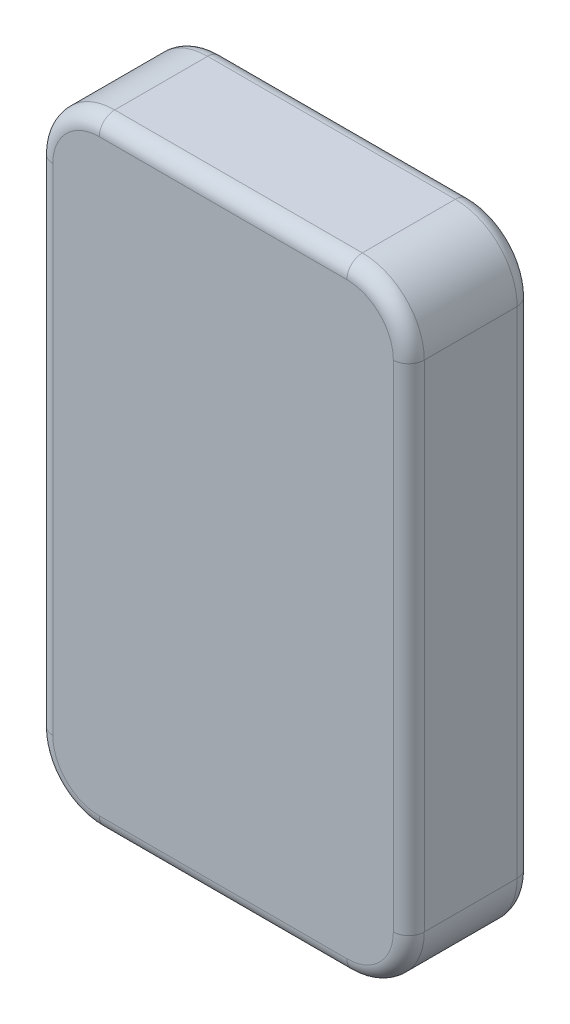
ISO-10303-21;
HEADER;
FILE_DESCRIPTION(('STEP AP214'),'2;1');
FILE_NAME('part.step','',(''),(''),'','','');
FILE_SCHEMA(('AUTOMOTIVE_DESIGN { 1 0 10303 214 1 1 1 1 }'));
ENDSEC;
DATA;
#1=APPLICATION_CONTEXT('core data for automotive mechanical design processes');
#2=APPLICATION_PROTOCOL_DEFINITION('international standard','automotive_design',2000,#1);
#3=PRODUCT_CONTEXT('',#1,'mechanical');
#4=PRODUCT('Part','Part','',(#3));
#5=PRODUCT_RELATED_PRODUCT_CATEGORY('part','',(#4));
#6=PRODUCT_DEFINITION_FORMATION('','',#4);
#7=PRODUCT_DEFINITION_CONTEXT('part definition',#1,'design');
#8=PRODUCT_DEFINITION('design','',#6,#7);
#9=PRODUCT_DEFINITION_SHAPE('','',#8);
#10=(LENGTH_UNIT() NAMED_UNIT(*) SI_UNIT(.MILLI.,.METRE.));
#11=(NAMED_UNIT(*) PLANE_ANGLE_UNIT() SI_UNIT($,.RADIAN.));
#12=(NAMED_UNIT(*) SI_UNIT($,.STERADIAN.) SOLID_ANGLE_UNIT());
#13=UNCERTAINTY_MEASURE_WITH_UNIT(LENGTH_MEASURE(1.E-05),#10,'distance_accuracy_value','');
#14=(GEOMETRIC_REPRESENTATION_CONTEXT(3) GLOBAL_UNCERTAINTY_ASSIGNED_CONTEXT((#13)) GLOBAL_UNIT_ASSIGNED_CONTEXT((#10,
#11,#12)) REPRESENTATION_CONTEXT('',''));
#15=CARTESIAN_POINT('',(0.,0.,0.));
#16=DIRECTION('',(0.,0.,1.));
#17=DIRECTION('',(1.,0.,0.));
#18=AXIS2_PLACEMENT_3D('',#15,#16,#17);
#19=CARTESIAN_POINT('',(-47.4485607369744,362.247885871218,-8.));
#20=DIRECTION('',(-1.,0.,0.));
#21=DIRECTION('',(0.,-1.,0.));
#22=AXIS2_PLACEMENT_3D('',#19,#20,#21);
#23=PLANE('',#22);
#24=DIRECTION('',(0.,0.,1.));
#25=VECTOR('',#24,1.);
#26=CARTESIAN_POINT('',(-47.4485607369744,358.247885871218,-8.));
#27=LINE('',#26,#25);
#28=CARTESIAN_POINT('',(-47.4485607369744,358.247885871218,-1.));
#29=VERTEX_POINT('',#28);
#30=CARTESIAN_POINT('',(-47.4485607369744,358.247885871218,-7.));
#31=VERTEX_POINT('',#30);
#32=EDGE_CURVE('E174',#29,#31,#27,.F.);
#33=ORIENTED_EDGE('',*,*,#32,.T.);
#34=DIRECTION('',(0.,-1.,0.));
#35=VECTOR('',#34,1.);
#36=CARTESIAN_POINT('',(-47.4485607369744,326.247885871218,-7.));
#37=LINE('',#36,#35);
#38=CARTESIAN_POINT('',(-47.4485607369744,326.247885871218,-7.));
#39=VERTEX_POINT('',#38);
#40=EDGE_CURVE('E213',#31,#39,#37,.T.);
#41=ORIENTED_EDGE('',*,*,#40,.T.);
#42=DIRECTION('',(0.,0.,1.));
#43=VECTOR('',#42,1.);
#44=CARTESIAN_POINT('',(-47.4485607369744,326.247885871218,-8.));
#45=LINE('',#44,#43);
#46=CARTESIAN_POINT('',(-47.4485607369744,326.247885871218,-1.));
#47=VERTEX_POINT('',#46);
#48=EDGE_CURVE('E171',#39,#47,#45,.T.);
#49=ORIENTED_EDGE('',*,*,#48,.T.);
#50=DIRECTION('',(0.,-1.,0.));
#51=VECTOR('',#50,1.);
#52=CARTESIAN_POINT('',(-47.4485607369744,362.247885871218,-1.));
#53=LINE('',#52,#51);
#54=EDGE_CURVE('E211',#47,#29,#53,.F.);
#55=ORIENTED_EDGE('',*,*,#54,.T.);
#56=EDGE_LOOP('',(#33,#41,#49,#55));
#57=FACE_BOUND('',#56,.T.);
#58=ADVANCED_FACE('F32',(#57),#23,.T.);
#59=CARTESIAN_POINT('',(-47.4485607369744,362.247885871218,-8.));
#60=DIRECTION('',(0.,1.,0.));
#61=DIRECTION('',(0.,0.,1.));
#62=AXIS2_PLACEMENT_3D('',#59,#60,#61);
#63=PLANE('',#62);
#64=DIRECTION('',(0.,0.,1.));
#65=VECTOR('',#64,1.);
#66=CARTESIAN_POINT('',(-43.4485607369744,362.247885871218,-8.));
#67=LINE('',#66,#65);
#68=CARTESIAN_POINT('',(-43.4485607369744,362.247885871218,-7.));
#69=VERTEX_POINT('',#68);
#70=CARTESIAN_POINT('',(-43.4485607369744,362.247885871218,-1.));
#71=VERTEX_POINT('',#70);
#72=EDGE_CURVE('E285',#69,#71,#67,.T.);
#73=ORIENTED_EDGE('',*,*,#72,.T.);
#74=DIRECTION('',(-1.,0.,0.));
#75=VECTOR('',#74,1.);
#76=CARTESIAN_POINT('',(-47.4485607369744,362.247885871218,-1.));
#77=LINE('',#76,#75);
#78=CARTESIAN_POINT('',(-27.4485607369744,362.247885871218,-1.));
#79=VERTEX_POINT('',#78);
#80=EDGE_CURVE('E11',#71,#79,#77,.F.);
#81=ORIENTED_EDGE('',*,*,#80,.T.);
#82=DIRECTION('',(0.,0.,1.));
#83=VECTOR('',#82,1.);
#84=CARTESIAN_POINT('',(-27.4485607369744,362.247885871218,-8.));
#85=LINE('',#84,#83);
#86=CARTESIAN_POINT('',(-27.4485607369744,362.247885871218,-7.));
#87=VERTEX_POINT('',#86);
#88=EDGE_CURVE('E291',#79,#87,#85,.F.);
#89=ORIENTED_EDGE('',*,*,#88,.T.);
#90=DIRECTION('',(-1.,0.,0.));
#91=VECTOR('',#90,1.);
#92=CARTESIAN_POINT('',(-43.4485607369744,362.247885871218,-7.));
#93=LINE('',#92,#91);
#94=EDGE_CURVE('E41',#87,#69,#93,.T.);
#95=ORIENTED_EDGE('',*,*,#94,.T.);
#96=EDGE_LOOP('',(#73,#81,#89,#95));
#97=FACE_BOUND('',#96,.T.);
#98=ADVANCED_FACE('F288',(#97),#63,.T.);
#99=CARTESIAN_POINT('',(-23.4485607369744,362.247885871218,-8.));
#100=DIRECTION('',(1.,0.,0.));
#101=DIRECTION('',(0.,1.,0.));
#102=AXIS2_PLACEMENT_3D('',#99,#100,#101);
#103=PLANE('',#102);
#104=DIRECTION('',(0.,0.,1.));
#105=VECTOR('',#104,1.);
#106=CARTESIAN_POINT('',(-23.4485607369744,326.247885871218,-8.));
#107=LINE('',#106,#105);
#108=CARTESIAN_POINT('',(-23.4485607369744,326.247885871218,-1.));
#109=VERTEX_POINT('',#108);
#110=CARTESIAN_POINT('',(-23.4485607369744,326.247885871218,-7.));
#111=VERTEX_POINT('',#110);
#112=EDGE_CURVE('E248',#109,#111,#107,.F.);
#113=ORIENTED_EDGE('',*,*,#112,.T.);
#114=DIRECTION('',(0.,1.,0.));
#115=VECTOR('',#114,1.);
#116=CARTESIAN_POINT('',(-23.4485607369744,358.247885871218,-7.));
#117=LINE('',#116,#115);
#118=CARTESIAN_POINT('',(-23.4485607369744,358.247885871218,-7.));
#119=VERTEX_POINT('',#118);
#120=EDGE_CURVE('E196',#111,#119,#117,.T.);
#121=ORIENTED_EDGE('',*,*,#120,.T.);
#122=DIRECTION('',(0.,0.,1.));
#123=VECTOR('',#122,1.);
#124=CARTESIAN_POINT('',(-23.4485607369744,358.247885871218,-8.));
#125=LINE('',#124,#123);
#126=CARTESIAN_POINT('',(-23.4485607369744,358.247885871218,-1.));
#127=VERTEX_POINT('',#126);
#128=EDGE_CURVE('E292',#119,#127,#125,.T.);
#129=ORIENTED_EDGE('',*,*,#128,.T.);
#130=DIRECTION('',(0.,1.,0.));
#131=VECTOR('',#130,1.);
#132=CARTESIAN_POINT('',(-23.4485607369744,362.247885871218,-1.));
#133=LINE('',#132,#131);
#134=EDGE_CURVE('E194',#127,#109,#133,.F.);
#135=ORIENTED_EDGE('',*,*,#134,.T.);
#136=EDGE_LOOP('',(#113,#121,#129,#135));
#137=FACE_BOUND('',#136,.T.);
#138=ADVANCED_FACE('F359',(#137),#103,.T.);
#139=CARTESIAN_POINT('',(-47.4485607369744,322.247885871218,-8.));
#140=DIRECTION('',(0.,-1.,0.));
#141=DIRECTION('',(0.,0.,-1.));
#142=AXIS2_PLACEMENT_3D('',#139,#140,#141);
#143=PLANE('',#142);
#144=DIRECTION('',(0.,0.,1.));
#145=VECTOR('',#144,1.);
#146=CARTESIAN_POINT('',(-43.4485607369744,322.247885871218,-8.));
#147=LINE('',#146,#145);
#148=CARTESIAN_POINT('',(-43.4485607369744,322.247885871218,-1.));
#149=VERTEX_POINT('',#148);
#150=CARTESIAN_POINT('',(-43.4485607369744,322.247885871218,-7.));
#151=VERTEX_POINT('',#150);
#152=EDGE_CURVE('E294',#149,#151,#147,.F.);
#153=ORIENTED_EDGE('',*,*,#152,.T.);
#154=DIRECTION('',(1.,0.,0.));
#155=VECTOR('',#154,1.);
#156=CARTESIAN_POINT('',(-27.4485607369744,322.247885871218,-7.));
#157=LINE('',#156,#155);
#158=CARTESIAN_POINT('',(-27.4485607369744,322.247885871218,-7.));
#159=VERTEX_POINT('',#158);
#160=EDGE_CURVE('E205',#151,#159,#157,.T.);
#161=ORIENTED_EDGE('',*,*,#160,.T.);
#162=DIRECTION('',(0.,0.,1.));
#163=VECTOR('',#162,1.);
#164=CARTESIAN_POINT('',(-27.4485607369744,322.247885871218,-8.));
#165=LINE('',#164,#163);
#166=CARTESIAN_POINT('',(-27.4485607369744,322.247885871218,-1.));
#167=VERTEX_POINT('',#166);
#168=EDGE_CURVE('E302',#159,#167,#165,.T.);
#169=ORIENTED_EDGE('',*,*,#168,.T.);
#170=DIRECTION('',(1.,0.,0.));
#171=VECTOR('',#170,1.);
#172=CARTESIAN_POINT('',(-47.4485607369744,322.247885871218,-1.));
#173=LINE('',#172,#171);
#174=EDGE_CURVE('E203',#167,#149,#173,.F.);
#175=ORIENTED_EDGE('',*,*,#174,.T.);
#176=EDGE_LOOP('',(#153,#161,#169,#175));
#177=FACE_BOUND('',#176,.T.);
#178=ADVANCED_FACE('F321',(#177),#143,.T.);
#179=CARTESIAN_POINT('',(0.,0.,-8.));
#180=DIRECTION('',(0.,0.,1.));
#181=DIRECTION('',(1.,0.,0.));
#182=AXIS2_PLACEMENT_3D('',#179,#180,#181);
#183=PLANE('',#182);
#184=DIRECTION('',(-1.,0.,0.));
#185=VECTOR('',#184,1.);
#186=CARTESIAN_POINT('',(-27.4485607369744,361.247885871218,-8.));
#187=LINE('',#186,#185);
#188=CARTESIAN_POINT('',(-43.4485607369744,361.247885871218,-8.));
#189=VERTEX_POINT('',#188);
#190=CARTESIAN_POINT('',(-27.4485607369744,361.247885871218,-8.));
#191=VERTEX_POINT('',#190);
#192=EDGE_CURVE('E150',#189,#191,#187,.F.);
#193=ORIENTED_EDGE('',*,*,#192,.T.);
#194=CARTESIAN_POINT('',(-27.4485607369744,358.247885871218,-8.));
#195=DIRECTION('',(0.,0.,1.));
#196=DIRECTION('',(1.,0.,0.));
#197=AXIS2_PLACEMENT_3D('',#194,#195,#196);
#198=CIRCLE('',#197,3.);
#199=CARTESIAN_POINT('',(-24.4485607369744,358.247885871218,-8.));
#200=VERTEX_POINT('',#199);
#201=EDGE_CURVE('E187',#191,#200,#198,.F.);
#202=ORIENTED_EDGE('',*,*,#201,.T.);
#203=DIRECTION('',(0.,1.,0.));
#204=VECTOR('',#203,1.);
#205=CARTESIAN_POINT('',(-24.4485607369744,326.247885871218,-8.));
#206=LINE('',#205,#204);
#207=CARTESIAN_POINT('',(-24.4485607369744,326.247885871218,-8.));
#208=VERTEX_POINT('',#207);
#209=EDGE_CURVE('E185',#200,#208,#206,.F.);
#210=ORIENTED_EDGE('',*,*,#209,.T.);
#211=CARTESIAN_POINT('',(-27.4485607369744,326.247885871218,-8.));
#212=DIRECTION('',(0.,0.,1.));
#213=DIRECTION('',(1.,0.,0.));
#214=AXIS2_PLACEMENT_3D('',#211,#212,#213);
#215=CIRCLE('',#214,3.);
#216=CARTESIAN_POINT('',(-27.4485607369744,323.247885871218,-8.));
#217=VERTEX_POINT('',#216);
#218=EDGE_CURVE('E183',#208,#217,#215,.F.);
#219=ORIENTED_EDGE('',*,*,#218,.T.);
#220=DIRECTION('',(1.,0.,0.));
#221=VECTOR('',#220,1.);
#222=CARTESIAN_POINT('',(-43.4485607369744,323.247885871218,-8.));
#223=LINE('',#222,#221);
#224=CARTESIAN_POINT('',(-43.4485607369744,323.247885871218,-8.));
#225=VERTEX_POINT('',#224);
#226=EDGE_CURVE('E181',#217,#225,#223,.F.);
#227=ORIENTED_EDGE('',*,*,#226,.T.);
#228=CARTESIAN_POINT('',(-43.4485607369744,326.247885871218,-8.));
#229=DIRECTION('',(0.,0.,1.));
#230=DIRECTION('',(1.,0.,0.));
#231=AXIS2_PLACEMENT_3D('',#228,#229,#230);
#232=CIRCLE('',#231,3.);
#233=CARTESIAN_POINT('',(-46.4485607369744,326.247885871218,-8.));
#234=VERTEX_POINT('',#233);
#235=EDGE_CURVE('E179',#225,#234,#232,.F.);
#236=ORIENTED_EDGE('',*,*,#235,.T.);
#237=DIRECTION('',(0.,-1.,0.));
#238=VECTOR('',#237,1.);
#239=CARTESIAN_POINT('',(-46.4485607369744,358.247885871218,-8.));
#240=LINE('',#239,#238);
#241=CARTESIAN_POINT('',(-46.4485607369744,358.247885871218,-8.));
#242=VERTEX_POINT('',#241);
#243=EDGE_CURVE('E153',#234,#242,#240,.F.);
#244=ORIENTED_EDGE('',*,*,#243,.T.);
#245=CARTESIAN_POINT('',(-43.4485607369744,358.247885871218,-8.));
#246=DIRECTION('',(0.,0.,1.));
#247=DIRECTION('',(1.,0.,0.));
#248=AXIS2_PLACEMENT_3D('',#245,#246,#247);
#249=CIRCLE('',#248,3.);
#250=EDGE_CURVE('E145',#242,#189,#249,.F.);
#251=ORIENTED_EDGE('',*,*,#250,.T.);
#252=EDGE_LOOP('',(#193,#202,#210,#219,#227,#236,#244,#251));
#253=FACE_BOUND('',#252,.T.);
#254=ADVANCED_FACE('F147',(#253),#183,.F.);
#255=CARTESIAN_POINT('',(0.,0.,0.));
#256=DIRECTION('',(0.,0.,1.));
#257=DIRECTION('',(1.,0.,0.));
#258=AXIS2_PLACEMENT_3D('',#255,#256,#257);
#259=PLANE('',#258);
#260=DIRECTION('',(1.,0.,0.));
#261=VECTOR('',#260,1.);
#262=CARTESIAN_POINT('',(0.,323.247885871218,0.));
#263=LINE('',#262,#261);
#264=CARTESIAN_POINT('',(-43.4485607369744,323.247885871218,0.));
#265=VERTEX_POINT('',#264);
#266=CARTESIAN_POINT('',(-27.4485607369744,323.247885871218,0.));
#267=VERTEX_POINT('',#266);
#268=EDGE_CURVE('E49',#265,#267,#263,.T.);
#269=ORIENTED_EDGE('',*,*,#268,.T.);
#270=CARTESIAN_POINT('',(-27.4485607369744,326.247885871218,0.));
#271=DIRECTION('',(0.,0.,1.));
#272=DIRECTION('',(1.,0.,0.));
#273=AXIS2_PLACEMENT_3D('',#270,#271,#272);
#274=CIRCLE('',#273,3.);
#275=CARTESIAN_POINT('',(-24.4485607369744,326.247885871218,0.));
#276=VERTEX_POINT('',#275);
#277=EDGE_CURVE('E230',#267,#276,#274,.T.);
#278=ORIENTED_EDGE('',*,*,#277,.T.);
#279=DIRECTION('',(0.,1.,0.));
#280=VECTOR('',#279,1.);
#281=CARTESIAN_POINT('',(-24.4485607369744,0.,0.));
#282=LINE('',#281,#280);
#283=CARTESIAN_POINT('',(-24.4485607369744,358.247885871218,0.));
#284=VERTEX_POINT('',#283);
#285=EDGE_CURVE('E218',#276,#284,#282,.T.);
#286=ORIENTED_EDGE('',*,*,#285,.T.);
#287=CARTESIAN_POINT('',(-27.4485607369744,358.247885871218,0.));
#288=DIRECTION('',(0.,0.,1.));
#289=DIRECTION('',(1.,0.,0.));
#290=AXIS2_PLACEMENT_3D('',#287,#288,#289);
#291=CIRCLE('',#290,3.);
#292=CARTESIAN_POINT('',(-27.4485607369744,361.247885871218,0.));
#293=VERTEX_POINT('',#292);
#294=EDGE_CURVE('E220',#284,#293,#291,.T.);
#295=ORIENTED_EDGE('',*,*,#294,.T.);
#296=DIRECTION('',(-1.,0.,0.));
#297=VECTOR('',#296,1.);
#298=CARTESIAN_POINT('',(0.,361.247885871218,0.));
#299=LINE('',#298,#297);
#300=CARTESIAN_POINT('',(-43.4485607369744,361.247885871218,0.));
#301=VERTEX_POINT('',#300);
#302=EDGE_CURVE('E222',#293,#301,#299,.T.);
#303=ORIENTED_EDGE('',*,*,#302,.T.);
#304=CARTESIAN_POINT('',(-43.4485607369744,358.247885871218,0.));
#305=DIRECTION('',(0.,0.,1.));
#306=DIRECTION('',(1.,0.,0.));
#307=AXIS2_PLACEMENT_3D('',#304,#305,#306);
#308=CIRCLE('',#307,3.);
#309=CARTESIAN_POINT('',(-46.4485607369744,358.247885871218,0.));
#310=VERTEX_POINT('',#309);
#311=EDGE_CURVE('E224',#301,#310,#308,.T.);
#312=ORIENTED_EDGE('',*,*,#311,.T.);
#313=DIRECTION('',(0.,-1.,0.));
#314=VECTOR('',#313,1.);
#315=CARTESIAN_POINT('',(-46.4485607369744,0.,0.));
#316=LINE('',#315,#314);
#317=CARTESIAN_POINT('',(-46.4485607369744,326.247885871218,0.));
#318=VERTEX_POINT('',#317);
#319=EDGE_CURVE('E226',#310,#318,#316,.T.);
#320=ORIENTED_EDGE('',*,*,#319,.T.);
#321=CARTESIAN_POINT('',(-43.4485607369744,326.247885871218,0.));
#322=DIRECTION('',(0.,0.,1.));
#323=DIRECTION('',(1.,0.,0.));
#324=AXIS2_PLACEMENT_3D('',#321,#322,#323);
#325=CIRCLE('',#324,3.);
#326=EDGE_CURVE('E54',#318,#265,#325,.T.);
#327=ORIENTED_EDGE('',*,*,#326,.T.);
#328=EDGE_LOOP('',(#269,#278,#286,#295,#303,#312,#320,#327));
#329=FACE_BOUND('',#328,.T.);
#330=ADVANCED_FACE('F342',(#329),#259,.T.);
#331=CARTESIAN_POINT('',(-27.4485607369744,358.247885871218,-8.));
#332=DIRECTION('',(0.,0.,1.));
#333=DIRECTION('',(1.,0.,0.));
#334=AXIS2_PLACEMENT_3D('',#331,#332,#333);
#335=CYLINDRICAL_SURFACE('',#334,4.);
#336=ORIENTED_EDGE('',*,*,#128,.F.);
#337=CARTESIAN_POINT('',(-27.4485607369744,358.247885871218,-7.));
#338=DIRECTION('',(0.,0.,1.));
#339=DIRECTION('',(1.,0.,0.));
#340=AXIS2_PLACEMENT_3D('',#337,#338,#339);
#341=CIRCLE('',#340,4.);
#342=EDGE_CURVE('E191',#119,#87,#341,.T.);
#343=ORIENTED_EDGE('',*,*,#342,.T.);
#344=ORIENTED_EDGE('',*,*,#88,.F.);
#345=CARTESIAN_POINT('',(-27.4485607369744,358.247885871218,-1.));
#346=DIRECTION('',(0.,0.,1.));
#347=DIRECTION('',(1.,0.,0.));
#348=AXIS2_PLACEMENT_3D('',#345,#346,#347);
#349=CIRCLE('',#348,4.);
#350=EDGE_CURVE('E189',#79,#127,#349,.F.);
#351=ORIENTED_EDGE('',*,*,#350,.T.);
#352=EDGE_LOOP('',(#336,#343,#344,#351));
#353=FACE_BOUND('',#352,.T.);
#354=ADVANCED_FACE('F344',(#353),#335,.T.);
#355=CARTESIAN_POINT('',(-27.4485607369744,326.247885871218,-8.));
#356=DIRECTION('',(0.,0.,1.));
#357=DIRECTION('',(1.,0.,0.));
#358=AXIS2_PLACEMENT_3D('',#355,#356,#357);
#359=CYLINDRICAL_SURFACE('',#358,4.);
#360=ORIENTED_EDGE('',*,*,#168,.F.);
#361=CARTESIAN_POINT('',(-27.4485607369744,326.247885871218,-7.));
#362=DIRECTION('',(0.,0.,1.));
#363=DIRECTION('',(1.,0.,0.));
#364=AXIS2_PLACEMENT_3D('',#361,#362,#363);
#365=CIRCLE('',#364,4.);
#366=EDGE_CURVE('E201',#159,#111,#365,.T.);
#367=ORIENTED_EDGE('',*,*,#366,.T.);
#368=ORIENTED_EDGE('',*,*,#112,.F.);
#369=CARTESIAN_POINT('',(-27.4485607369744,326.247885871218,-1.));
#370=DIRECTION('',(0.,0.,1.));
#371=DIRECTION('',(1.,0.,0.));
#372=AXIS2_PLACEMENT_3D('',#369,#370,#371);
#373=CIRCLE('',#372,4.);
#374=EDGE_CURVE('E198',#109,#167,#373,.F.);
#375=ORIENTED_EDGE('',*,*,#374,.T.);
#376=EDGE_LOOP('',(#360,#367,#368,#375));
#377=FACE_BOUND('',#376,.T.);
#378=ADVANCED_FACE('F330',(#377),#359,.T.);
#379=CARTESIAN_POINT('',(-43.4485607369744,326.247885871218,-8.));
#380=DIRECTION('',(0.,0.,1.));
#381=DIRECTION('',(1.,0.,0.));
#382=AXIS2_PLACEMENT_3D('',#379,#380,#381);
#383=CYLINDRICAL_SURFACE('',#382,4.);
#384=ORIENTED_EDGE('',*,*,#48,.F.);
#385=CARTESIAN_POINT('',(-43.4485607369744,326.247885871218,-7.));
#386=DIRECTION('',(0.,0.,1.));
#387=DIRECTION('',(1.,0.,0.));
#388=AXIS2_PLACEMENT_3D('',#385,#386,#387);
#389=CIRCLE('',#388,4.);
#390=EDGE_CURVE('E209',#39,#151,#389,.T.);
#391=ORIENTED_EDGE('',*,*,#390,.T.);
#392=ORIENTED_EDGE('',*,*,#152,.F.);
#393=CARTESIAN_POINT('',(-43.4485607369744,326.247885871218,-1.));
#394=DIRECTION('',(0.,0.,1.));
#395=DIRECTION('',(1.,0.,0.));
#396=AXIS2_PLACEMENT_3D('',#393,#394,#395);
#397=CIRCLE('',#396,4.);
#398=EDGE_CURVE('E207',#149,#47,#397,.F.);
#399=ORIENTED_EDGE('',*,*,#398,.T.);
#400=EDGE_LOOP('',(#384,#391,#392,#399));
#401=FACE_BOUND('',#400,.T.);
#402=ADVANCED_FACE('F318',(#401),#383,.T.);
#403=CARTESIAN_POINT('',(-43.4485607369744,358.247885871218,-8.));
#404=DIRECTION('',(0.,0.,1.));
#405=DIRECTION('',(1.,0.,0.));
#406=AXIS2_PLACEMENT_3D('',#403,#404,#405);
#407=CYLINDRICAL_SURFACE('',#406,4.);
#408=ORIENTED_EDGE('',*,*,#72,.F.);
#409=CARTESIAN_POINT('',(-43.4485607369744,358.247885871218,-7.));
#410=DIRECTION('',(0.,0.,1.));
#411=DIRECTION('',(1.,0.,0.));
#412=AXIS2_PLACEMENT_3D('',#409,#410,#411);
#413=CIRCLE('',#412,4.);
#414=EDGE_CURVE('E162',#69,#31,#413,.T.);
#415=ORIENTED_EDGE('',*,*,#414,.T.);
#416=ORIENTED_EDGE('',*,*,#32,.F.);
#417=CARTESIAN_POINT('',(-43.4485607369744,358.247885871218,-1.));
#418=DIRECTION('',(0.,0.,1.));
#419=DIRECTION('',(1.,0.,0.));
#420=AXIS2_PLACEMENT_3D('',#417,#418,#419);
#421=CIRCLE('',#420,4.);
#422=EDGE_CURVE('E215',#29,#71,#421,.F.);
#423=ORIENTED_EDGE('',*,*,#422,.T.);
#424=EDGE_LOOP('',(#408,#415,#416,#423));
#425=FACE_BOUND('',#424,.T.);
#426=ADVANCED_FACE('F284',(#425),#407,.T.);
#427=CARTESIAN_POINT('',(-43.4485607369744,326.247885871218,-7.));
#428=DIRECTION('',(0.,0.,1.));
#429=DIRECTION('',(1.,0.,0.));
#430=AXIS2_PLACEMENT_3D('',#427,#428,#429);
#431=TOROIDAL_SURFACE('',#430,3.,1.);
#432=CARTESIAN_POINT('',(-43.4485607369744,323.247885871218,-7.));
#433=DIRECTION('',(1.,0.,0.));
#434=DIRECTION('',(0.,0.,-1.));
#435=AXIS2_PLACEMENT_3D('',#432,#433,#434);
#436=CIRCLE('',#435,1.);
#437=EDGE_CURVE('E242',#151,#225,#436,.T.);
#438=ORIENTED_EDGE('',*,*,#437,.F.);
#439=ORIENTED_EDGE('',*,*,#390,.F.);
#440=CARTESIAN_POINT('',(-46.4485607369744,326.247885871218,-7.));
#441=DIRECTION('',(0.,1.,0.));
#442=DIRECTION('',(0.,0.,1.));
#443=AXIS2_PLACEMENT_3D('',#440,#441,#442);
#444=CIRCLE('',#443,1.);
#445=EDGE_CURVE('E245',#234,#39,#444,.T.);
#446=ORIENTED_EDGE('',*,*,#445,.F.);
#447=ORIENTED_EDGE('',*,*,#235,.F.);
#448=EDGE_LOOP('',(#438,#439,#446,#447));
#449=FACE_BOUND('',#448,.T.);
#450=ADVANCED_FACE('F314',(#449),#431,.T.);
#451=CARTESIAN_POINT('',(-46.4485607369744,362.247885871218,-7.));
#452=DIRECTION('',(0.,1.,0.));
#453=DIRECTION('',(-1.,0.,0.));
#454=AXIS2_PLACEMENT_3D('',#451,#452,#453);
#455=CYLINDRICAL_SURFACE('',#454,1.);
#456=ORIENTED_EDGE('',*,*,#445,.T.);
#457=ORIENTED_EDGE('',*,*,#40,.F.);
#458=CARTESIAN_POINT('',(-46.4485607369744,358.247885871218,-7.));
#459=DIRECTION('',(0.,1.,0.));
#460=DIRECTION('',(0.,0.,1.));
#461=AXIS2_PLACEMENT_3D('',#458,#459,#460);
#462=CIRCLE('',#461,1.);
#463=EDGE_CURVE('E240',#242,#31,#462,.T.);
#464=ORIENTED_EDGE('',*,*,#463,.F.);
#465=ORIENTED_EDGE('',*,*,#243,.F.);
#466=EDGE_LOOP('',(#456,#457,#464,#465));
#467=FACE_BOUND('',#466,.T.);
#468=ADVANCED_FACE('F308',(#467),#455,.T.);
#469=CARTESIAN_POINT('',(-47.4485607369744,323.247885871218,-7.));
#470=DIRECTION('',(-1.,0.,0.));
#471=DIRECTION('',(0.,0.,1.));
#472=AXIS2_PLACEMENT_3D('',#469,#470,#471);
#473=CYLINDRICAL_SURFACE('',#472,1.);
#474=ORIENTED_EDGE('',*,*,#437,.T.);
#475=ORIENTED_EDGE('',*,*,#226,.F.);
#476=CARTESIAN_POINT('',(-27.4485607369744,323.247885871218,-7.));
#477=DIRECTION('',(1.,0.,0.));
#478=DIRECTION('',(0.,0.,-1.));
#479=AXIS2_PLACEMENT_3D('',#476,#477,#478);
#480=CIRCLE('',#479,1.);
#481=EDGE_CURVE('E165',#159,#217,#480,.T.);
#482=ORIENTED_EDGE('',*,*,#481,.F.);
#483=ORIENTED_EDGE('',*,*,#160,.F.);
#484=EDGE_LOOP('',(#474,#475,#482,#483));
#485=FACE_BOUND('',#484,.T.);
#486=ADVANCED_FACE('F385',(#485),#473,.T.);
#487=CARTESIAN_POINT('',(-43.4485607369744,358.247885871218,-7.));
#488=DIRECTION('',(0.,0.,1.));
#489=DIRECTION('',(1.,0.,0.));
#490=AXIS2_PLACEMENT_3D('',#487,#488,#489);
#491=TOROIDAL_SURFACE('',#490,3.,1.);
#492=ORIENTED_EDGE('',*,*,#463,.T.);
#493=ORIENTED_EDGE('',*,*,#414,.F.);
#494=CARTESIAN_POINT('',(-43.4485607369744,361.247885871218,-7.));
#495=DIRECTION('',(1.,0.,0.));
#496=DIRECTION('',(0.,0.,-1.));
#497=AXIS2_PLACEMENT_3D('',#494,#495,#496);
#498=CIRCLE('',#497,1.);
#499=EDGE_CURVE('E160',#189,#69,#498,.T.);
#500=ORIENTED_EDGE('',*,*,#499,.F.);
#501=ORIENTED_EDGE('',*,*,#250,.F.);
#502=EDGE_LOOP('',(#492,#493,#500,#501));
#503=FACE_BOUND('',#502,.T.);
#504=ADVANCED_FACE('F161',(#503),#491,.T.);
#505=CARTESIAN_POINT('',(-27.4485607369744,326.247885871218,-7.));
#506=DIRECTION('',(0.,0.,1.));
#507=DIRECTION('',(1.,0.,0.));
#508=AXIS2_PLACEMENT_3D('',#505,#506,#507);
#509=TOROIDAL_SURFACE('',#508,3.,1.);
#510=ORIENTED_EDGE('',*,*,#481,.T.);
#511=ORIENTED_EDGE('',*,*,#218,.F.);
#512=CARTESIAN_POINT('',(-24.4485607369744,326.247885871218,-7.));
#513=DIRECTION('',(0.,1.,0.));
#514=DIRECTION('',(0.,0.,1.));
#515=AXIS2_PLACEMENT_3D('',#512,#513,#514);
#516=CIRCLE('',#515,1.);
#517=EDGE_CURVE('E166',#111,#208,#516,.T.);
#518=ORIENTED_EDGE('',*,*,#517,.F.);
#519=ORIENTED_EDGE('',*,*,#366,.F.);
#520=EDGE_LOOP('',(#510,#511,#518,#519));
#521=FACE_BOUND('',#520,.T.);
#522=ADVANCED_FACE('F379',(#521),#509,.T.);
#523=CARTESIAN_POINT('',(-47.4485607369744,361.247885871218,-7.));
#524=DIRECTION('',(1.,0.,0.));
#525=DIRECTION('',(0.,0.,-1.));
#526=AXIS2_PLACEMENT_3D('',#523,#524,#525);
#527=CYLINDRICAL_SURFACE('',#526,1.);
#528=ORIENTED_EDGE('',*,*,#499,.T.);
#529=ORIENTED_EDGE('',*,*,#94,.F.);
#530=CARTESIAN_POINT('',(-27.4485607369744,361.247885871218,-7.));
#531=DIRECTION('',(1.,0.,0.));
#532=DIRECTION('',(0.,0.,-1.));
#533=AXIS2_PLACEMENT_3D('',#530,#531,#532);
#534=CIRCLE('',#533,1.);
#535=EDGE_CURVE('E169',#191,#87,#534,.T.);
#536=ORIENTED_EDGE('',*,*,#535,.F.);
#537=ORIENTED_EDGE('',*,*,#192,.F.);
#538=EDGE_LOOP('',(#528,#529,#536,#537));
#539=FACE_BOUND('',#538,.T.);
#540=ADVANCED_FACE('F168',(#539),#527,.T.);
#541=CARTESIAN_POINT('',(-24.4485607369744,362.247885871218,-7.));
#542=DIRECTION('',(0.,-1.,0.));
#543=DIRECTION('',(1.,0.,0.));
#544=AXIS2_PLACEMENT_3D('',#541,#542,#543);
#545=CYLINDRICAL_SURFACE('',#544,1.);
#546=ORIENTED_EDGE('',*,*,#517,.T.);
#547=ORIENTED_EDGE('',*,*,#209,.F.);
#548=CARTESIAN_POINT('',(-24.4485607369744,358.247885871218,-7.));
#549=DIRECTION('',(0.,1.,0.));
#550=DIRECTION('',(0.,0.,1.));
#551=AXIS2_PLACEMENT_3D('',#548,#549,#550);
#552=CIRCLE('',#551,1.);
#553=EDGE_CURVE('E233',#119,#200,#552,.T.);
#554=ORIENTED_EDGE('',*,*,#553,.F.);
#555=ORIENTED_EDGE('',*,*,#120,.F.);
#556=EDGE_LOOP('',(#546,#547,#554,#555));
#557=FACE_BOUND('',#556,.T.);
#558=ADVANCED_FACE('F372',(#557),#545,.T.);
#559=CARTESIAN_POINT('',(-27.4485607369744,358.247885871218,-7.));
#560=DIRECTION('',(0.,0.,1.));
#561=DIRECTION('',(1.,0.,0.));
#562=AXIS2_PLACEMENT_3D('',#559,#560,#561);
#563=TOROIDAL_SURFACE('',#562,3.,1.);
#564=ORIENTED_EDGE('',*,*,#535,.T.);
#565=ORIENTED_EDGE('',*,*,#342,.F.);
#566=ORIENTED_EDGE('',*,*,#553,.T.);
#567=ORIENTED_EDGE('',*,*,#201,.F.);
#568=EDGE_LOOP('',(#564,#565,#566,#567));
#569=FACE_BOUND('',#568,.T.);
#570=ADVANCED_FACE('F369',(#569),#563,.T.);
#571=CARTESIAN_POINT('',(-43.4485607369744,358.247885871218,-1.));
#572=DIRECTION('',(0.,0.,1.));
#573=DIRECTION('',(1.,0.,0.));
#574=AXIS2_PLACEMENT_3D('',#571,#572,#573);
#575=TOROIDAL_SURFACE('',#574,3.,1.);
#576=CARTESIAN_POINT('',(-43.4485607369744,361.247885871218,-1.));
#577=DIRECTION('',(1.,0.,0.));
#578=DIRECTION('',(0.,0.,-1.));
#579=AXIS2_PLACEMENT_3D('',#576,#577,#578);
#580=CIRCLE('',#579,1.);
#581=EDGE_CURVE('E264',#71,#301,#580,.T.);
#582=ORIENTED_EDGE('',*,*,#581,.F.);
#583=ORIENTED_EDGE('',*,*,#422,.F.);
#584=CARTESIAN_POINT('',(-46.4485607369744,358.247885871218,-1.));
#585=DIRECTION('',(0.,-1.,0.));
#586=DIRECTION('',(0.,0.,-1.));
#587=AXIS2_PLACEMENT_3D('',#584,#585,#586);
#588=CIRCLE('',#587,1.);
#589=EDGE_CURVE('E36',#310,#29,#588,.T.);
#590=ORIENTED_EDGE('',*,*,#589,.F.);
#591=ORIENTED_EDGE('',*,*,#311,.F.);
#592=EDGE_LOOP('',(#582,#583,#590,#591));
#593=FACE_BOUND('',#592,.T.);
#594=ADVANCED_FACE('F34',(#593),#575,.T.);
#595=CARTESIAN_POINT('',(-46.4485607369744,0.,-1.));
#596=DIRECTION('',(0.,-1.,0.));
#597=DIRECTION('',(1.,0.,0.));
#598=AXIS2_PLACEMENT_3D('',#595,#596,#597);
#599=CYLINDRICAL_SURFACE('',#598,1.);
#600=ORIENTED_EDGE('',*,*,#589,.T.);
#601=ORIENTED_EDGE('',*,*,#54,.F.);
#602=CARTESIAN_POINT('',(-46.4485607369744,326.247885871218,-1.));
#603=DIRECTION('',(0.,-1.,0.));
#604=DIRECTION('',(0.,0.,-1.));
#605=AXIS2_PLACEMENT_3D('',#602,#603,#604);
#606=CIRCLE('',#605,1.);
#607=EDGE_CURVE('E262',#318,#47,#606,.T.);
#608=ORIENTED_EDGE('',*,*,#607,.F.);
#609=ORIENTED_EDGE('',*,*,#319,.F.);
#610=EDGE_LOOP('',(#600,#601,#608,#609));
#611=FACE_BOUND('',#610,.T.);
#612=ADVANCED_FACE('F275',(#611),#599,.T.);
#613=CARTESIAN_POINT('',(0.,361.247885871218,-1.));
#614=DIRECTION('',(-1.,0.,0.));
#615=DIRECTION('',(0.,0.,1.));
#616=AXIS2_PLACEMENT_3D('',#613,#614,#615);
#617=CYLINDRICAL_SURFACE('',#616,1.);
#618=ORIENTED_EDGE('',*,*,#581,.T.);
#619=ORIENTED_EDGE('',*,*,#302,.F.);
#620=CARTESIAN_POINT('',(-27.4485607369744,361.247885871218,-1.));
#621=DIRECTION('',(1.,0.,0.));
#622=DIRECTION('',(0.,0.,-1.));
#623=AXIS2_PLACEMENT_3D('',#620,#621,#622);
#624=CIRCLE('',#623,1.);
#625=EDGE_CURVE('E259',#79,#293,#624,.T.);
#626=ORIENTED_EDGE('',*,*,#625,.F.);
#627=ORIENTED_EDGE('',*,*,#80,.F.);
#628=EDGE_LOOP('',(#618,#619,#626,#627));
#629=FACE_BOUND('',#628,.T.);
#630=ADVANCED_FACE('F406',(#629),#617,.T.);
#631=CARTESIAN_POINT('',(-43.4485607369744,326.247885871218,-1.));
#632=DIRECTION('',(0.,0.,1.));
#633=DIRECTION('',(1.,0.,0.));
#634=AXIS2_PLACEMENT_3D('',#631,#632,#633);
#635=TOROIDAL_SURFACE('',#634,3.,1.);
#636=ORIENTED_EDGE('',*,*,#607,.T.);
#637=ORIENTED_EDGE('',*,*,#398,.F.);
#638=CARTESIAN_POINT('',(-43.4485607369744,323.247885871218,-1.));
#639=DIRECTION('',(1.,0.,0.));
#640=DIRECTION('',(0.,0.,-1.));
#641=AXIS2_PLACEMENT_3D('',#638,#639,#640);
#642=CIRCLE('',#641,1.);
#643=EDGE_CURVE('E256',#265,#149,#642,.T.);
#644=ORIENTED_EDGE('',*,*,#643,.F.);
#645=ORIENTED_EDGE('',*,*,#326,.F.);
#646=EDGE_LOOP('',(#636,#637,#644,#645));
#647=FACE_BOUND('',#646,.T.);
#648=ADVANCED_FACE('F402',(#647),#635,.T.);
#649=CARTESIAN_POINT('',(-27.4485607369744,358.247885871218,-1.));
#650=DIRECTION('',(0.,0.,1.));
#651=DIRECTION('',(1.,0.,0.));
#652=AXIS2_PLACEMENT_3D('',#649,#650,#651);
#653=TOROIDAL_SURFACE('',#652,3.,1.);
#654=ORIENTED_EDGE('',*,*,#625,.T.);
#655=ORIENTED_EDGE('',*,*,#294,.F.);
#656=CARTESIAN_POINT('',(-24.4485607369744,358.247885871218,-1.));
#657=DIRECTION('',(0.,-1.,0.));
#658=DIRECTION('',(0.,0.,-1.));
#659=AXIS2_PLACEMENT_3D('',#656,#657,#658);
#660=CIRCLE('',#659,1.);
#661=EDGE_CURVE('E253',#127,#284,#660,.T.);
#662=ORIENTED_EDGE('',*,*,#661,.F.);
#663=ORIENTED_EDGE('',*,*,#350,.F.);
#664=EDGE_LOOP('',(#654,#655,#662,#663));
#665=FACE_BOUND('',#664,.T.);
#666=ADVANCED_FACE('F399',(#665),#653,.T.);
#667=CARTESIAN_POINT('',(0.,323.247885871218,-1.));
#668=DIRECTION('',(1.,0.,0.));
#669=DIRECTION('',(0.,0.,-1.));
#670=AXIS2_PLACEMENT_3D('',#667,#668,#669);
#671=CYLINDRICAL_SURFACE('',#670,1.);
#672=ORIENTED_EDGE('',*,*,#643,.T.);
#673=ORIENTED_EDGE('',*,*,#174,.F.);
#674=CARTESIAN_POINT('',(-27.4485607369744,323.247885871218,-1.));
#675=DIRECTION('',(1.,0.,0.));
#676=DIRECTION('',(0.,0.,-1.));
#677=AXIS2_PLACEMENT_3D('',#674,#675,#676);
#678=CIRCLE('',#677,1.);
#679=EDGE_CURVE('E251',#267,#167,#678,.T.);
#680=ORIENTED_EDGE('',*,*,#679,.F.);
#681=ORIENTED_EDGE('',*,*,#268,.F.);
#682=EDGE_LOOP('',(#672,#673,#680,#681));
#683=FACE_BOUND('',#682,.T.);
#684=ADVANCED_FACE('F325',(#683),#671,.T.);
#685=CARTESIAN_POINT('',(-24.4485607369744,0.,-1.));
#686=DIRECTION('',(0.,1.,0.));
#687=DIRECTION('',(-1.,0.,0.));
#688=AXIS2_PLACEMENT_3D('',#685,#686,#687);
#689=CYLINDRICAL_SURFACE('',#688,1.);
#690=ORIENTED_EDGE('',*,*,#661,.T.);
#691=ORIENTED_EDGE('',*,*,#285,.F.);
#692=CARTESIAN_POINT('',(-24.4485607369744,326.247885871218,-1.));
#693=DIRECTION('',(0.,-1.,0.));
#694=DIRECTION('',(0.,0.,-1.));
#695=AXIS2_PLACEMENT_3D('',#692,#693,#694);
#696=CIRCLE('',#695,1.);
#697=EDGE_CURVE('E249',#109,#276,#696,.T.);
#698=ORIENTED_EDGE('',*,*,#697,.F.);
#699=ORIENTED_EDGE('',*,*,#134,.F.);
#700=EDGE_LOOP('',(#690,#691,#698,#699));
#701=FACE_BOUND('',#700,.T.);
#702=ADVANCED_FACE('F339',(#701),#689,.T.);
#703=CARTESIAN_POINT('',(-27.4485607369744,326.247885871218,-1.));
#704=DIRECTION('',(0.,0.,1.));
#705=DIRECTION('',(1.,0.,0.));
#706=AXIS2_PLACEMENT_3D('',#703,#704,#705);
#707=TOROIDAL_SURFACE('',#706,3.,1.);
#708=ORIENTED_EDGE('',*,*,#679,.T.);
#709=ORIENTED_EDGE('',*,*,#374,.F.);
#710=ORIENTED_EDGE('',*,*,#697,.T.);
#711=ORIENTED_EDGE('',*,*,#277,.F.);
#712=EDGE_LOOP('',(#708,#709,#710,#711));
#713=FACE_BOUND('',#712,.T.);
#714=ADVANCED_FACE('F335',(#713),#707,.T.);
#715=CLOSED_SHELL('',(#58,#98,#138,#178,#254,#330,#354,#378,#402,#426,#450,#468,#486,#504,#522,
#540,#558,#570,#594,#612,#630,#648,#666,#684,#702,#714));
#716=MANIFOLD_SOLID_BREP('B2',#715);
#717=ADVANCED_BREP_SHAPE_REPRESENTATION('',(#18,#716),#14);
#718=SHAPE_DEFINITION_REPRESENTATION(#9,#717);
ENDSEC;
END-ISO-10303-21;
